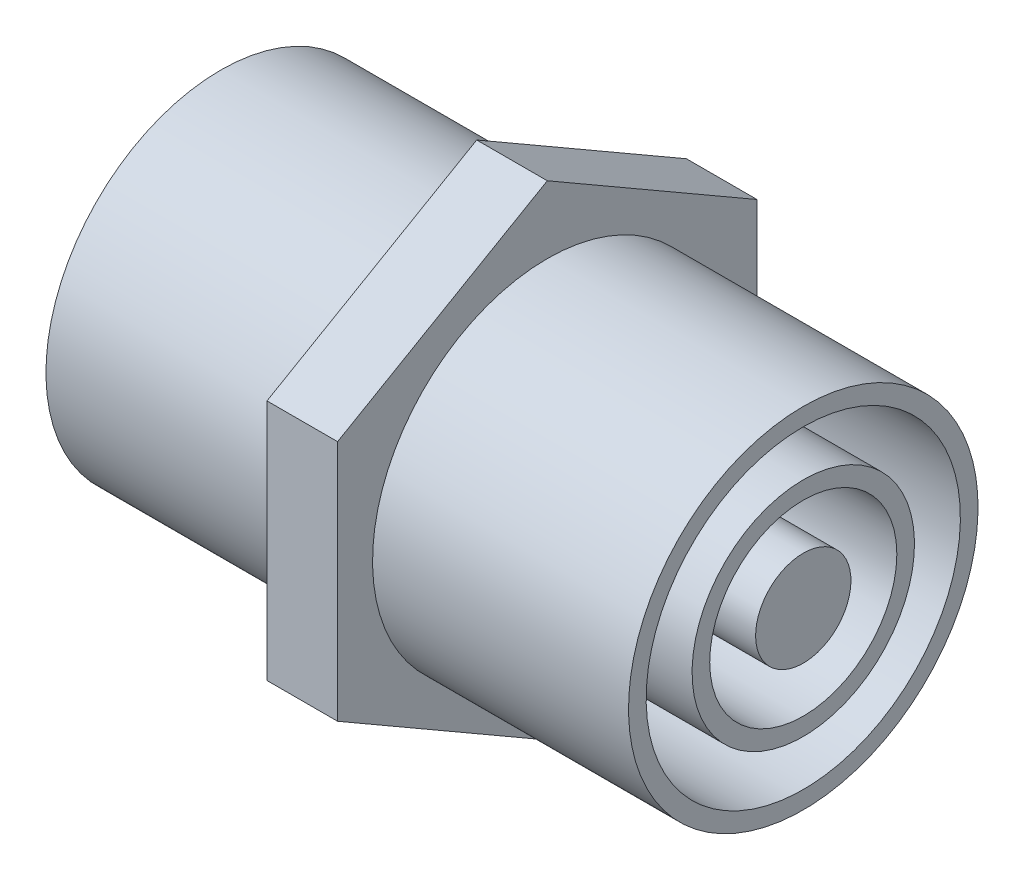
ISO-10303-21;
HEADER;
FILE_DESCRIPTION(('STEP AP214'),'2;1');
FILE_NAME('part.step','',(''),(''),'','','');
FILE_SCHEMA(('AUTOMOTIVE_DESIGN { 1 0 10303 214 1 1 1 1 }'));
ENDSEC;
DATA;
#1=APPLICATION_CONTEXT('core data for automotive mechanical design processes');
#2=APPLICATION_PROTOCOL_DEFINITION('international standard','automotive_design',2000,#1);
#3=PRODUCT_CONTEXT('',#1,'mechanical');
#4=PRODUCT('Part','Part','',(#3));
#5=PRODUCT_RELATED_PRODUCT_CATEGORY('part','',(#4));
#6=PRODUCT_DEFINITION_FORMATION('','',#4);
#7=PRODUCT_DEFINITION_CONTEXT('part definition',#1,'design');
#8=PRODUCT_DEFINITION('design','',#6,#7);
#9=PRODUCT_DEFINITION_SHAPE('','',#8);
#10=(LENGTH_UNIT() NAMED_UNIT(*) SI_UNIT(.MILLI.,.METRE.));
#11=(NAMED_UNIT(*) PLANE_ANGLE_UNIT() SI_UNIT($,.RADIAN.));
#12=(NAMED_UNIT(*) SI_UNIT($,.STERADIAN.) SOLID_ANGLE_UNIT());
#13=UNCERTAINTY_MEASURE_WITH_UNIT(LENGTH_MEASURE(1.E-05),#10,'distance_accuracy_value','');
#14=(GEOMETRIC_REPRESENTATION_CONTEXT(3) GLOBAL_UNCERTAINTY_ASSIGNED_CONTEXT((#13)) GLOBAL_UNIT_ASSIGNED_CONTEXT((#10,
#11,#12)) REPRESENTATION_CONTEXT('',''));
#15=CARTESIAN_POINT('',(0.,0.,0.));
#16=DIRECTION('',(0.,0.,1.));
#17=DIRECTION('',(1.,0.,0.));
#18=AXIS2_PLACEMENT_3D('',#15,#16,#17);
#19=CARTESIAN_POINT('',(0.,0.,0.));
#20=DIRECTION('',(-1.,0.,0.));
#21=DIRECTION('',(0.,-1.,0.));
#22=AXIS2_PLACEMENT_3D('',#19,#20,#21);
#23=PLANE('',#22);
#24=CARTESIAN_POINT('',(0.,0.,0.));
#25=DIRECTION('',(1.,0.,0.));
#26=DIRECTION('',(0.,1.,0.));
#27=AXIS2_PLACEMENT_3D('',#24,#25,#26);
#28=CIRCLE('',#27,1.35);
#29=CARTESIAN_POINT('',(0.,1.35,0.));
#30=VERTEX_POINT('',#29);
#31=EDGE_CURVE('E11',#30,#30,#28,.T.);
#32=ORIENTED_EDGE('',*,*,#31,.F.);
#33=EDGE_LOOP('',(#32));
#34=FACE_BOUND('',#33,.T.);
#35=ADVANCED_FACE('F49',(#34),#23,.T.);
#36=CARTESIAN_POINT('',(8.24999999999999,0.,0.));
#37=DIRECTION('',(1.,0.,0.));
#38=DIRECTION('',(0.,1.,0.));
#39=AXIS2_PLACEMENT_3D('',#36,#37,#38);
#40=CYLINDRICAL_SURFACE('',#39,1.35);
#41=ORIENTED_EDGE('',*,*,#31,.T.);
#42=EDGE_LOOP('',(#41));
#43=FACE_BOUND('',#42,.T.);
#44=CARTESIAN_POINT('',(7.25,0.,0.));
#45=DIRECTION('',(1.,0.,0.));
#46=DIRECTION('',(0.,1.,0.));
#47=AXIS2_PLACEMENT_3D('',#44,#45,#46);
#48=CIRCLE('',#47,1.35);
#49=CARTESIAN_POINT('',(7.25,1.35,0.));
#50=VERTEX_POINT('',#49);
#51=EDGE_CURVE('E57',#50,#50,#48,.T.);
#52=ORIENTED_EDGE('',*,*,#51,.F.);
#53=EDGE_LOOP('',(#52));
#54=FACE_BOUND('',#53,.T.);
#55=ADVANCED_FACE('F253',(#43,#54),#40,.T.);
#56=CARTESIAN_POINT('',(7.25,1.35,0.));
#57=DIRECTION('',(-1.,0.,0.));
#58=DIRECTION('',(0.,-1.,0.));
#59=AXIS2_PLACEMENT_3D('',#56,#57,#58);
#60=PLANE('',#59);
#61=ORIENTED_EDGE('',*,*,#51,.T.);
#62=EDGE_LOOP('',(#61));
#63=FACE_BOUND('',#62,.T.);
#64=CARTESIAN_POINT('',(7.25,0.,0.));
#65=DIRECTION('',(1.,0.,0.));
#66=DIRECTION('',(0.,1.,0.));
#67=AXIS2_PLACEMENT_3D('',#64,#65,#66);
#68=CIRCLE('',#67,2.65);
#69=CARTESIAN_POINT('',(7.25,2.65,0.));
#70=VERTEX_POINT('',#69);
#71=EDGE_CURVE('E241',#70,#70,#68,.T.);
#72=ORIENTED_EDGE('',*,*,#71,.F.);
#73=EDGE_LOOP('',(#72));
#74=FACE_BOUND('',#73,.T.);
#75=ADVANCED_FACE('F250',(#63,#74),#60,.T.);
#76=CARTESIAN_POINT('',(8.24999999999999,0.,0.));
#77=DIRECTION('',(1.,0.,0.));
#78=DIRECTION('',(0.,1.,0.));
#79=AXIS2_PLACEMENT_3D('',#76,#77,#78);
#80=CYLINDRICAL_SURFACE('',#79,2.65);
#81=ORIENTED_EDGE('',*,*,#71,.T.);
#82=EDGE_LOOP('',(#81));
#83=FACE_BOUND('',#82,.T.);
#84=CARTESIAN_POINT('',(0.,0.,0.));
#85=DIRECTION('',(1.,0.,0.));
#86=DIRECTION('',(0.,1.,0.));
#87=AXIS2_PLACEMENT_3D('',#84,#85,#86);
#88=CIRCLE('',#87,2.65);
#89=CARTESIAN_POINT('',(0.,2.65,0.));
#90=VERTEX_POINT('',#89);
#91=EDGE_CURVE('E237',#90,#90,#88,.T.);
#92=ORIENTED_EDGE('',*,*,#91,.F.);
#93=EDGE_LOOP('',(#92));
#94=FACE_BOUND('',#93,.T.);
#95=ADVANCED_FACE('F260',(#83,#94),#80,.F.);
#96=CARTESIAN_POINT('',(0.,2.65,0.));
#97=DIRECTION('',(-1.,0.,0.));
#98=DIRECTION('',(0.,-1.,0.));
#99=AXIS2_PLACEMENT_3D('',#96,#97,#98);
#100=PLANE('',#99);
#101=ORIENTED_EDGE('',*,*,#91,.T.);
#102=EDGE_LOOP('',(#101));
#103=FACE_BOUND('',#102,.T.);
#104=CARTESIAN_POINT('',(0.,0.,0.));
#105=DIRECTION('',(1.,0.,0.));
#106=DIRECTION('',(0.,1.,0.));
#107=AXIS2_PLACEMENT_3D('',#104,#105,#106);
#108=CIRCLE('',#107,3.15);
#109=CARTESIAN_POINT('',(0.,3.15,0.));
#110=VERTEX_POINT('',#109);
#111=EDGE_CURVE('E233',#110,#110,#108,.T.);
#112=ORIENTED_EDGE('',*,*,#111,.F.);
#113=EDGE_LOOP('',(#112));
#114=FACE_BOUND('',#113,.T.);
#115=ADVANCED_FACE('F266',(#103,#114),#100,.T.);
#116=CARTESIAN_POINT('',(8.24999999999999,0.,0.));
#117=DIRECTION('',(1.,0.,0.));
#118=DIRECTION('',(0.,1.,0.));
#119=AXIS2_PLACEMENT_3D('',#116,#117,#118);
#120=CYLINDRICAL_SURFACE('',#119,3.15);
#121=ORIENTED_EDGE('',*,*,#111,.T.);
#122=EDGE_LOOP('',(#121));
#123=FACE_BOUND('',#122,.T.);
#124=CARTESIAN_POINT('',(7.25,0.,0.));
#125=DIRECTION('',(1.,0.,0.));
#126=DIRECTION('',(0.,1.,0.));
#127=AXIS2_PLACEMENT_3D('',#124,#125,#126);
#128=CIRCLE('',#127,3.15);
#129=CARTESIAN_POINT('',(7.25,3.15,0.));
#130=VERTEX_POINT('',#129);
#131=EDGE_CURVE('E229',#130,#130,#128,.T.);
#132=ORIENTED_EDGE('',*,*,#131,.F.);
#133=EDGE_LOOP('',(#132));
#134=FACE_BOUND('',#133,.T.);
#135=ADVANCED_FACE('F270',(#123,#134),#120,.T.);
#136=CARTESIAN_POINT('',(7.25,4.45,0.));
#137=DIRECTION('',(-1.,0.,0.));
#138=DIRECTION('',(0.,-1.,0.));
#139=AXIS2_PLACEMENT_3D('',#136,#137,#138);
#140=PLANE('',#139);
#141=ORIENTED_EDGE('',*,*,#131,.T.);
#142=EDGE_LOOP('',(#141));
#143=FACE_BOUND('',#142,.T.);
#144=CARTESIAN_POINT('',(7.25,0.,0.));
#145=DIRECTION('',(1.,0.,0.));
#146=DIRECTION('',(0.,1.,0.));
#147=AXIS2_PLACEMENT_3D('',#144,#145,#146);
#148=CIRCLE('',#147,4.45);
#149=CARTESIAN_POINT('',(7.25,4.45,0.));
#150=VERTEX_POINT('',#149);
#151=EDGE_CURVE('E225',#150,#150,#148,.T.);
#152=ORIENTED_EDGE('',*,*,#151,.F.);
#153=EDGE_LOOP('',(#152));
#154=FACE_BOUND('',#153,.T.);
#155=ADVANCED_FACE('F274',(#143,#154),#140,.T.);
#156=CARTESIAN_POINT('',(8.24999999999999,0.,0.));
#157=DIRECTION('',(1.,0.,0.));
#158=DIRECTION('',(0.,1.,0.));
#159=AXIS2_PLACEMENT_3D('',#156,#157,#158);
#160=CYLINDRICAL_SURFACE('',#159,4.45);
#161=ORIENTED_EDGE('',*,*,#151,.T.);
#162=EDGE_LOOP('',(#161));
#163=FACE_BOUND('',#162,.T.);
#164=CARTESIAN_POINT('',(0.,0.,0.));
#165=DIRECTION('',(1.,0.,0.));
#166=DIRECTION('',(0.,1.,0.));
#167=AXIS2_PLACEMENT_3D('',#164,#165,#166);
#168=CIRCLE('',#167,4.45);
#169=CARTESIAN_POINT('',(0.,4.45,0.));
#170=VERTEX_POINT('',#169);
#171=EDGE_CURVE('E221',#170,#170,#168,.T.);
#172=ORIENTED_EDGE('',*,*,#171,.F.);
#173=EDGE_LOOP('',(#172));
#174=FACE_BOUND('',#173,.T.);
#175=ADVANCED_FACE('F278',(#163,#174),#160,.F.);
#176=CARTESIAN_POINT('',(0.,4.95,0.));
#177=DIRECTION('',(-1.,0.,0.));
#178=DIRECTION('',(0.,-1.,0.));
#179=AXIS2_PLACEMENT_3D('',#176,#177,#178);
#180=PLANE('',#179);
#181=ORIENTED_EDGE('',*,*,#171,.T.);
#182=EDGE_LOOP('',(#181));
#183=FACE_BOUND('',#182,.T.);
#184=CARTESIAN_POINT('',(0.,0.,0.));
#185=DIRECTION('',(1.,0.,0.));
#186=DIRECTION('',(0.,1.,0.));
#187=AXIS2_PLACEMENT_3D('',#184,#185,#186);
#188=CIRCLE('',#187,4.95);
#189=CARTESIAN_POINT('',(0.,4.95,0.));
#190=VERTEX_POINT('',#189);
#191=EDGE_CURVE('E217',#190,#190,#188,.T.);
#192=ORIENTED_EDGE('',*,*,#191,.F.);
#193=EDGE_LOOP('',(#192));
#194=FACE_BOUND('',#193,.T.);
#195=ADVANCED_FACE('F282',(#183,#194),#180,.T.);
#196=CARTESIAN_POINT('',(8.24999999999999,0.,0.));
#197=DIRECTION('',(1.,0.,0.));
#198=DIRECTION('',(0.,1.,0.));
#199=AXIS2_PLACEMENT_3D('',#196,#197,#198);
#200=CYLINDRICAL_SURFACE('',#199,4.95);
#201=ORIENTED_EDGE('',*,*,#191,.T.);
#202=EDGE_LOOP('',(#201));
#203=FACE_BOUND('',#202,.T.);
#204=CARTESIAN_POINT('',(7.25,0.,0.));
#205=DIRECTION('',(1.,0.,0.));
#206=DIRECTION('',(0.,1.,0.));
#207=AXIS2_PLACEMENT_3D('',#204,#205,#206);
#208=CIRCLE('',#207,4.95);
#209=CARTESIAN_POINT('',(7.25,4.95,0.));
#210=VERTEX_POINT('',#209);
#211=EDGE_CURVE('E203',#210,#210,#208,.T.);
#212=ORIENTED_EDGE('',*,*,#211,.F.);
#213=EDGE_LOOP('',(#212));
#214=FACE_BOUND('',#213,.T.);
#215=ADVANCED_FACE('F286',(#203,#214),#200,.T.);
#216=CARTESIAN_POINT('',(7.25,5.85,0.));
#217=DIRECTION('',(-1.,0.,0.));
#218=DIRECTION('',(0.,-1.,0.));
#219=AXIS2_PLACEMENT_3D('',#216,#217,#218);
#220=PLANE('',#219);
#221=ORIENTED_EDGE('',*,*,#211,.T.);
#222=EDGE_LOOP('',(#221));
#223=FACE_BOUND('',#222,.T.);
#224=DIRECTION('',(0.,0.5,0.866025403784439));
#225=VECTOR('',#224,1.);
#226=CARTESIAN_POINT('',(7.25,3.42946059898638,-5.94));
#227=LINE('',#226,#225);
#228=CARTESIAN_POINT('',(7.25,3.42946059898638,-5.94));
#229=VERTEX_POINT('',#228);
#230=CARTESIAN_POINT('',(7.24999999999999,6.85892119797276,0.));
#231=VERTEX_POINT('',#230);
#232=EDGE_CURVE('E106',#229,#231,#227,.T.);
#233=ORIENTED_EDGE('',*,*,#232,.F.);
#234=DIRECTION('',(0.,1.,0.));
#235=VECTOR('',#234,1.);
#236=CARTESIAN_POINT('',(7.25,-3.42946059898638,-5.94));
#237=LINE('',#236,#235);
#238=CARTESIAN_POINT('',(7.25,-3.42946059898638,-5.94));
#239=VERTEX_POINT('',#238);
#240=EDGE_CURVE('E112',#239,#229,#237,.T.);
#241=ORIENTED_EDGE('',*,*,#240,.F.);
#242=DIRECTION('',(0.,0.5,-0.866025403784439));
#243=VECTOR('',#242,1.);
#244=CARTESIAN_POINT('',(7.25,-6.85892119797275,0.));
#245=LINE('',#244,#243);
#246=CARTESIAN_POINT('',(7.25,-6.85892119797275,0.));
#247=VERTEX_POINT('',#246);
#248=EDGE_CURVE('E196',#247,#239,#245,.T.);
#249=ORIENTED_EDGE('',*,*,#248,.F.);
#250=DIRECTION('',(0.,-0.5,-0.866025403784439));
#251=VECTOR('',#250,1.);
#252=CARTESIAN_POINT('',(7.25,-3.42946059898638,5.94));
#253=LINE('',#252,#251);
#254=CARTESIAN_POINT('',(7.25,-3.42946059898638,5.94));
#255=VERTEX_POINT('',#254);
#256=EDGE_CURVE('E192',#255,#247,#253,.T.);
#257=ORIENTED_EDGE('',*,*,#256,.F.);
#258=DIRECTION('',(0.,-1.,0.));
#259=VECTOR('',#258,1.);
#260=CARTESIAN_POINT('',(7.25,3.42946059898638,5.94));
#261=LINE('',#260,#259);
#262=CARTESIAN_POINT('',(7.25,3.42946059898638,5.94));
#263=VERTEX_POINT('',#262);
#264=EDGE_CURVE('E188',#263,#255,#261,.T.);
#265=ORIENTED_EDGE('',*,*,#264,.F.);
#266=DIRECTION('',(0.,-0.5,0.866025403784439));
#267=VECTOR('',#266,1.);
#268=CARTESIAN_POINT('',(7.24999999999999,6.85892119797276,0.));
#269=LINE('',#268,#267);
#270=EDGE_CURVE('E185',#231,#263,#269,.T.);
#271=ORIENTED_EDGE('',*,*,#270,.F.);
#272=EDGE_LOOP('',(#233,#241,#249,#257,#265,#271));
#273=FACE_BOUND('',#272,.T.);
#274=ADVANCED_FACE('F290',(#223,#273),#220,.T.);
#275=CARTESIAN_POINT('',(7.25,3.42946059898638,-5.94));
#276=DIRECTION('',(0.,0.866025403784439,-0.5));
#277=DIRECTION('',(0.,0.5,0.866025403784439));
#278=AXIS2_PLACEMENT_3D('',#275,#276,#277);
#279=PLANE('',#278);
#280=DIRECTION('',(1.,0.,0.));
#281=VECTOR('',#280,1.);
#282=CARTESIAN_POINT('',(7.24999999999999,6.85892119797276,0.));
#283=LINE('',#282,#281);
#284=CARTESIAN_POINT('',(9.24999999999999,6.85892119797276,0.));
#285=VERTEX_POINT('',#284);
#286=EDGE_CURVE('E101',#231,#285,#283,.T.);
#287=ORIENTED_EDGE('',*,*,#286,.T.);
#288=DIRECTION('',(0.,0.5,0.866025403784439));
#289=VECTOR('',#288,1.);
#290=CARTESIAN_POINT('',(9.24999999999999,3.42946059898638,-5.94));
#291=LINE('',#290,#289);
#292=CARTESIAN_POINT('',(9.24999999999999,3.42946059898638,-5.94));
#293=VERTEX_POINT('',#292);
#294=EDGE_CURVE('E105',#293,#285,#291,.T.);
#295=ORIENTED_EDGE('',*,*,#294,.F.);
#296=DIRECTION('',(1.,0.,0.));
#297=VECTOR('',#296,1.);
#298=CARTESIAN_POINT('',(7.25,3.42946059898638,-5.94));
#299=LINE('',#298,#297);
#300=EDGE_CURVE('E64',#229,#293,#299,.T.);
#301=ORIENTED_EDGE('',*,*,#300,.F.);
#302=ORIENTED_EDGE('',*,*,#232,.T.);
#303=EDGE_LOOP('',(#287,#295,#301,#302));
#304=FACE_BOUND('',#303,.T.);
#305=ADVANCED_FACE('F103',(#304),#279,.T.);
#306=CARTESIAN_POINT('',(7.25,-3.42946059898638,-5.94));
#307=DIRECTION('',(0.,0.,-1.));
#308=DIRECTION('',(-1.,0.,0.));
#309=AXIS2_PLACEMENT_3D('',#306,#307,#308);
#310=PLANE('',#309);
#311=ORIENTED_EDGE('',*,*,#300,.T.);
#312=DIRECTION('',(0.,1.,0.));
#313=VECTOR('',#312,1.);
#314=CARTESIAN_POINT('',(9.25,-3.42946059898638,-5.94));
#315=LINE('',#314,#313);
#316=CARTESIAN_POINT('',(9.25,-3.42946059898638,-5.94));
#317=VERTEX_POINT('',#316);
#318=EDGE_CURVE('E126',#317,#293,#315,.T.);
#319=ORIENTED_EDGE('',*,*,#318,.F.);
#320=DIRECTION('',(1.,0.,0.));
#321=VECTOR('',#320,1.);
#322=CARTESIAN_POINT('',(7.25,-3.42946059898638,-5.94));
#323=LINE('',#322,#321);
#324=EDGE_CURVE('E72',#239,#317,#323,.T.);
#325=ORIENTED_EDGE('',*,*,#324,.F.);
#326=ORIENTED_EDGE('',*,*,#240,.T.);
#327=EDGE_LOOP('',(#311,#319,#325,#326));
#328=FACE_BOUND('',#327,.T.);
#329=ADVANCED_FACE('F297',(#328),#310,.T.);
#330=CARTESIAN_POINT('',(7.25,-6.85892119797275,0.));
#331=DIRECTION('',(0.,-0.866025403784439,-0.5));
#332=DIRECTION('',(0.,0.5,-0.866025403784439));
#333=AXIS2_PLACEMENT_3D('',#330,#331,#332);
#334=PLANE('',#333);
#335=ORIENTED_EDGE('',*,*,#324,.T.);
#336=DIRECTION('',(0.,0.5,-0.866025403784439));
#337=VECTOR('',#336,1.);
#338=CARTESIAN_POINT('',(9.24999999999999,-6.85892119797275,0.));
#339=LINE('',#338,#337);
#340=CARTESIAN_POINT('',(9.24999999999999,-6.85892119797275,0.));
#341=VERTEX_POINT('',#340);
#342=EDGE_CURVE('E138',#341,#317,#339,.T.);
#343=ORIENTED_EDGE('',*,*,#342,.F.);
#344=DIRECTION('',(1.,0.,0.));
#345=VECTOR('',#344,1.);
#346=CARTESIAN_POINT('',(7.25,-6.85892119797275,0.));
#347=LINE('',#346,#345);
#348=EDGE_CURVE('E206',#247,#341,#347,.T.);
#349=ORIENTED_EDGE('',*,*,#348,.F.);
#350=ORIENTED_EDGE('',*,*,#248,.T.);
#351=EDGE_LOOP('',(#335,#343,#349,#350));
#352=FACE_BOUND('',#351,.T.);
#353=ADVANCED_FACE('F308',(#352),#334,.T.);
#354=CARTESIAN_POINT('',(7.25,-3.42946059898638,5.94));
#355=DIRECTION('',(0.,-0.866025403784439,0.5));
#356=DIRECTION('',(0.,-0.5,-0.866025403784439));
#357=AXIS2_PLACEMENT_3D('',#354,#355,#356);
#358=PLANE('',#357);
#359=ORIENTED_EDGE('',*,*,#348,.T.);
#360=DIRECTION('',(0.,-0.5,-0.866025403784439));
#361=VECTOR('',#360,1.);
#362=CARTESIAN_POINT('',(9.25,-3.42946059898638,5.94));
#363=LINE('',#362,#361);
#364=CARTESIAN_POINT('',(9.25,-3.42946059898638,5.94));
#365=VERTEX_POINT('',#364);
#366=EDGE_CURVE('E134',#365,#341,#363,.T.);
#367=ORIENTED_EDGE('',*,*,#366,.F.);
#368=DIRECTION('',(1.,0.,0.));
#369=VECTOR('',#368,1.);
#370=CARTESIAN_POINT('',(7.25,-3.42946059898638,5.94));
#371=LINE('',#370,#369);
#372=EDGE_CURVE('E209',#255,#365,#371,.T.);
#373=ORIENTED_EDGE('',*,*,#372,.F.);
#374=ORIENTED_EDGE('',*,*,#256,.T.);
#375=EDGE_LOOP('',(#359,#367,#373,#374));
#376=FACE_BOUND('',#375,.T.);
#377=ADVANCED_FACE('F304',(#376),#358,.T.);
#378=CARTESIAN_POINT('',(7.25,3.42946059898638,5.94));
#379=DIRECTION('',(0.,0.,1.));
#380=DIRECTION('',(1.,0.,0.));
#381=AXIS2_PLACEMENT_3D('',#378,#379,#380);
#382=PLANE('',#381);
#383=ORIENTED_EDGE('',*,*,#372,.T.);
#384=DIRECTION('',(0.,-1.,0.));
#385=VECTOR('',#384,1.);
#386=CARTESIAN_POINT('',(9.24999999999999,3.42946059898638,5.94));
#387=LINE('',#386,#385);
#388=CARTESIAN_POINT('',(9.24999999999999,3.42946059898638,5.94));
#389=VERTEX_POINT('',#388);
#390=EDGE_CURVE('E121',#389,#365,#387,.T.);
#391=ORIENTED_EDGE('',*,*,#390,.F.);
#392=DIRECTION('',(1.,0.,0.));
#393=VECTOR('',#392,1.);
#394=CARTESIAN_POINT('',(7.25,3.42946059898638,5.94));
#395=LINE('',#394,#393);
#396=EDGE_CURVE('E111',#263,#389,#395,.T.);
#397=ORIENTED_EDGE('',*,*,#396,.F.);
#398=ORIENTED_EDGE('',*,*,#264,.T.);
#399=EDGE_LOOP('',(#383,#391,#397,#398));
#400=FACE_BOUND('',#399,.T.);
#401=ADVANCED_FACE('F301',(#400),#382,.T.);
#402=CARTESIAN_POINT('',(7.24999999999999,6.85892119797276,0.));
#403=DIRECTION('',(0.,0.866025403784439,0.5));
#404=DIRECTION('',(0.,-0.5,0.866025403784439));
#405=AXIS2_PLACEMENT_3D('',#402,#403,#404);
#406=PLANE('',#405);
#407=ORIENTED_EDGE('',*,*,#396,.T.);
#408=DIRECTION('',(0.,-0.5,0.866025403784439));
#409=VECTOR('',#408,1.);
#410=CARTESIAN_POINT('',(9.24999999999999,6.85892119797276,0.));
#411=LINE('',#410,#409);
#412=EDGE_CURVE('E115',#285,#389,#411,.T.);
#413=ORIENTED_EDGE('',*,*,#412,.F.);
#414=ORIENTED_EDGE('',*,*,#286,.F.);
#415=ORIENTED_EDGE('',*,*,#270,.T.);
#416=EDGE_LOOP('',(#407,#413,#414,#415));
#417=FACE_BOUND('',#416,.T.);
#418=ADVANCED_FACE('F116',(#417),#406,.T.);
#419=CARTESIAN_POINT('',(16.5,0.,0.));
#420=DIRECTION('',(1.,0.,0.));
#421=DIRECTION('',(0.,-1.,0.));
#422=AXIS2_PLACEMENT_3D('',#419,#420,#421);
#423=PLANE('',#422);
#424=CARTESIAN_POINT('',(16.5,0.,0.));
#425=DIRECTION('',(1.,0.,0.));
#426=DIRECTION('',(0.,1.,0.));
#427=AXIS2_PLACEMENT_3D('',#424,#425,#426);
#428=CIRCLE('',#427,1.35);
#429=CARTESIAN_POINT('',(16.5,1.35,0.));
#430=VERTEX_POINT('',#429);
#431=EDGE_CURVE('E179',#430,#430,#428,.T.);
#432=ORIENTED_EDGE('',*,*,#431,.T.);
#433=EDGE_LOOP('',(#432));
#434=FACE_BOUND('',#433,.T.);
#435=ADVANCED_FACE('F300',(#434),#423,.T.);
#436=CARTESIAN_POINT('',(8.24999999999999,0.,0.));
#437=DIRECTION('',(-1.,0.,0.));
#438=DIRECTION('',(0.,1.,0.));
#439=AXIS2_PLACEMENT_3D('',#436,#437,#438);
#440=CYLINDRICAL_SURFACE('',#439,1.35);
#441=ORIENTED_EDGE('',*,*,#431,.F.);
#442=EDGE_LOOP('',(#441));
#443=FACE_BOUND('',#442,.T.);
#444=CARTESIAN_POINT('',(9.24999999999999,0.,0.));
#445=DIRECTION('',(1.,0.,0.));
#446=DIRECTION('',(0.,1.,0.));
#447=AXIS2_PLACEMENT_3D('',#444,#445,#446);
#448=CIRCLE('',#447,1.35);
#449=CARTESIAN_POINT('',(9.24999999999999,1.35,0.));
#450=VERTEX_POINT('',#449);
#451=EDGE_CURVE('E175',#450,#450,#448,.T.);
#452=ORIENTED_EDGE('',*,*,#451,.T.);
#453=EDGE_LOOP('',(#452));
#454=FACE_BOUND('',#453,.T.);
#455=ADVANCED_FACE('F317',(#443,#454),#440,.T.);
#456=CARTESIAN_POINT('',(9.24999999999999,1.35,0.));
#457=DIRECTION('',(1.,0.,0.));
#458=DIRECTION('',(0.,-1.,0.));
#459=AXIS2_PLACEMENT_3D('',#456,#457,#458);
#460=PLANE('',#459);
#461=ORIENTED_EDGE('',*,*,#451,.F.);
#462=EDGE_LOOP('',(#461));
#463=FACE_BOUND('',#462,.T.);
#464=CARTESIAN_POINT('',(9.24999999999999,0.,0.));
#465=DIRECTION('',(1.,0.,0.));
#466=DIRECTION('',(0.,1.,0.));
#467=AXIS2_PLACEMENT_3D('',#464,#465,#466);
#468=CIRCLE('',#467,2.65);
#469=CARTESIAN_POINT('',(9.24999999999999,2.65,0.));
#470=VERTEX_POINT('',#469);
#471=EDGE_CURVE('E171',#470,#470,#468,.T.);
#472=ORIENTED_EDGE('',*,*,#471,.T.);
#473=EDGE_LOOP('',(#472));
#474=FACE_BOUND('',#473,.T.);
#475=ADVANCED_FACE('F321',(#463,#474),#460,.T.);
#476=CARTESIAN_POINT('',(8.24999999999999,0.,0.));
#477=DIRECTION('',(-1.,0.,0.));
#478=DIRECTION('',(0.,1.,0.));
#479=AXIS2_PLACEMENT_3D('',#476,#477,#478);
#480=CYLINDRICAL_SURFACE('',#479,2.65);
#481=ORIENTED_EDGE('',*,*,#471,.F.);
#482=EDGE_LOOP('',(#481));
#483=FACE_BOUND('',#482,.T.);
#484=CARTESIAN_POINT('',(16.5,0.,0.));
#485=DIRECTION('',(1.,0.,0.));
#486=DIRECTION('',(0.,1.,0.));
#487=AXIS2_PLACEMENT_3D('',#484,#485,#486);
#488=CIRCLE('',#487,2.65);
#489=CARTESIAN_POINT('',(16.5,2.65,0.));
#490=VERTEX_POINT('',#489);
#491=EDGE_CURVE('E167',#490,#490,#488,.T.);
#492=ORIENTED_EDGE('',*,*,#491,.T.);
#493=EDGE_LOOP('',(#492));
#494=FACE_BOUND('',#493,.T.);
#495=ADVANCED_FACE('F325',(#483,#494),#480,.F.);
#496=CARTESIAN_POINT('',(16.5,2.65,0.));
#497=DIRECTION('',(1.,0.,0.));
#498=DIRECTION('',(0.,-1.,0.));
#499=AXIS2_PLACEMENT_3D('',#496,#497,#498);
#500=PLANE('',#499);
#501=ORIENTED_EDGE('',*,*,#491,.F.);
#502=EDGE_LOOP('',(#501));
#503=FACE_BOUND('',#502,.T.);
#504=CARTESIAN_POINT('',(16.5,0.,0.));
#505=DIRECTION('',(1.,0.,0.));
#506=DIRECTION('',(0.,1.,0.));
#507=AXIS2_PLACEMENT_3D('',#504,#505,#506);
#508=CIRCLE('',#507,3.15);
#509=CARTESIAN_POINT('',(16.5,3.15,0.));
#510=VERTEX_POINT('',#509);
#511=EDGE_CURVE('E163',#510,#510,#508,.T.);
#512=ORIENTED_EDGE('',*,*,#511,.T.);
#513=EDGE_LOOP('',(#512));
#514=FACE_BOUND('',#513,.T.);
#515=ADVANCED_FACE('F329',(#503,#514),#500,.T.);
#516=CARTESIAN_POINT('',(8.24999999999999,0.,0.));
#517=DIRECTION('',(-1.,0.,0.));
#518=DIRECTION('',(0.,1.,0.));
#519=AXIS2_PLACEMENT_3D('',#516,#517,#518);
#520=CYLINDRICAL_SURFACE('',#519,3.15);
#521=ORIENTED_EDGE('',*,*,#511,.F.);
#522=EDGE_LOOP('',(#521));
#523=FACE_BOUND('',#522,.T.);
#524=CARTESIAN_POINT('',(9.24999999999999,0.,0.));
#525=DIRECTION('',(1.,0.,0.));
#526=DIRECTION('',(0.,1.,0.));
#527=AXIS2_PLACEMENT_3D('',#524,#525,#526);
#528=CIRCLE('',#527,3.15);
#529=CARTESIAN_POINT('',(9.24999999999999,3.15,0.));
#530=VERTEX_POINT('',#529);
#531=EDGE_CURVE('E159',#530,#530,#528,.T.);
#532=ORIENTED_EDGE('',*,*,#531,.T.);
#533=EDGE_LOOP('',(#532));
#534=FACE_BOUND('',#533,.T.);
#535=ADVANCED_FACE('F333',(#523,#534),#520,.T.);
#536=CARTESIAN_POINT('',(9.24999999999999,4.45,0.));
#537=DIRECTION('',(1.,0.,0.));
#538=DIRECTION('',(0.,-1.,0.));
#539=AXIS2_PLACEMENT_3D('',#536,#537,#538);
#540=PLANE('',#539);
#541=ORIENTED_EDGE('',*,*,#531,.F.);
#542=EDGE_LOOP('',(#541));
#543=FACE_BOUND('',#542,.T.);
#544=CARTESIAN_POINT('',(9.24999999999999,0.,0.));
#545=DIRECTION('',(1.,0.,0.));
#546=DIRECTION('',(0.,1.,0.));
#547=AXIS2_PLACEMENT_3D('',#544,#545,#546);
#548=CIRCLE('',#547,4.45);
#549=CARTESIAN_POINT('',(9.24999999999999,4.45,0.));
#550=VERTEX_POINT('',#549);
#551=EDGE_CURVE('E155',#550,#550,#548,.T.);
#552=ORIENTED_EDGE('',*,*,#551,.T.);
#553=EDGE_LOOP('',(#552));
#554=FACE_BOUND('',#553,.T.);
#555=ADVANCED_FACE('F337',(#543,#554),#540,.T.);
#556=CARTESIAN_POINT('',(8.24999999999999,0.,0.));
#557=DIRECTION('',(-1.,0.,0.));
#558=DIRECTION('',(0.,1.,0.));
#559=AXIS2_PLACEMENT_3D('',#556,#557,#558);
#560=CYLINDRICAL_SURFACE('',#559,4.45);
#561=ORIENTED_EDGE('',*,*,#551,.F.);
#562=EDGE_LOOP('',(#561));
#563=FACE_BOUND('',#562,.T.);
#564=CARTESIAN_POINT('',(16.5,0.,0.));
#565=DIRECTION('',(1.,0.,0.));
#566=DIRECTION('',(0.,1.,0.));
#567=AXIS2_PLACEMENT_3D('',#564,#565,#566);
#568=CIRCLE('',#567,4.45);
#569=CARTESIAN_POINT('',(16.5,4.45,0.));
#570=VERTEX_POINT('',#569);
#571=EDGE_CURVE('E151',#570,#570,#568,.T.);
#572=ORIENTED_EDGE('',*,*,#571,.T.);
#573=EDGE_LOOP('',(#572));
#574=FACE_BOUND('',#573,.T.);
#575=ADVANCED_FACE('F341',(#563,#574),#560,.F.);
#576=CARTESIAN_POINT('',(16.5,4.95,0.));
#577=DIRECTION('',(1.,0.,0.));
#578=DIRECTION('',(0.,-1.,0.));
#579=AXIS2_PLACEMENT_3D('',#576,#577,#578);
#580=PLANE('',#579);
#581=ORIENTED_EDGE('',*,*,#571,.F.);
#582=EDGE_LOOP('',(#581));
#583=FACE_BOUND('',#582,.T.);
#584=CARTESIAN_POINT('',(16.5,0.,0.));
#585=DIRECTION('',(1.,0.,0.));
#586=DIRECTION('',(0.,1.,0.));
#587=AXIS2_PLACEMENT_3D('',#584,#585,#586);
#588=CIRCLE('',#587,4.95);
#589=CARTESIAN_POINT('',(16.5,4.95,0.));
#590=VERTEX_POINT('',#589);
#591=EDGE_CURVE('E147',#590,#590,#588,.T.);
#592=ORIENTED_EDGE('',*,*,#591,.T.);
#593=EDGE_LOOP('',(#592));
#594=FACE_BOUND('',#593,.T.);
#595=ADVANCED_FACE('F345',(#583,#594),#580,.T.);
#596=CARTESIAN_POINT('',(8.24999999999999,0.,0.));
#597=DIRECTION('',(-1.,0.,0.));
#598=DIRECTION('',(0.,1.,0.));
#599=AXIS2_PLACEMENT_3D('',#596,#597,#598);
#600=CYLINDRICAL_SURFACE('',#599,4.95);
#601=ORIENTED_EDGE('',*,*,#591,.F.);
#602=EDGE_LOOP('',(#601));
#603=FACE_BOUND('',#602,.T.);
#604=CARTESIAN_POINT('',(9.24999999999999,0.,0.));
#605=DIRECTION('',(1.,0.,0.));
#606=DIRECTION('',(0.,1.,0.));
#607=AXIS2_PLACEMENT_3D('',#604,#605,#606);
#608=CIRCLE('',#607,4.95);
#609=CARTESIAN_POINT('',(9.24999999999999,4.95,0.));
#610=VERTEX_POINT('',#609);
#611=EDGE_CURVE('E143',#610,#610,#608,.T.);
#612=ORIENTED_EDGE('',*,*,#611,.T.);
#613=EDGE_LOOP('',(#612));
#614=FACE_BOUND('',#613,.T.);
#615=ADVANCED_FACE('F349',(#603,#614),#600,.T.);
#616=CARTESIAN_POINT('',(9.24999999999999,5.85,0.));
#617=DIRECTION('',(1.,0.,0.));
#618=DIRECTION('',(0.,-1.,0.));
#619=AXIS2_PLACEMENT_3D('',#616,#617,#618);
#620=PLANE('',#619);
#621=ORIENTED_EDGE('',*,*,#611,.F.);
#622=EDGE_LOOP('',(#621));
#623=FACE_BOUND('',#622,.T.);
#624=ORIENTED_EDGE('',*,*,#294,.T.);
#625=ORIENTED_EDGE('',*,*,#412,.T.);
#626=ORIENTED_EDGE('',*,*,#390,.T.);
#627=ORIENTED_EDGE('',*,*,#366,.T.);
#628=ORIENTED_EDGE('',*,*,#342,.T.);
#629=ORIENTED_EDGE('',*,*,#318,.T.);
#630=EDGE_LOOP('',(#624,#625,#626,#627,#628,#629));
#631=FACE_BOUND('',#630,.T.);
#632=ADVANCED_FACE('F124',(#623,#631),#620,.T.);
#633=CLOSED_SHELL('',(#35,#55,#75,#95,#115,#135,#155,#175,#195,#215,#274,#305,#329,#353,#377,
#401,#418,#435,#455,#475,#495,#515,#535,#555,#575,#595,#615,#632));
#634=MANIFOLD_SOLID_BREP('B2',#633);
#635=ADVANCED_BREP_SHAPE_REPRESENTATION('',(#18,#634),#14);
#636=SHAPE_DEFINITION_REPRESENTATION(#9,#635);
ENDSEC;
END-ISO-10303-21;
